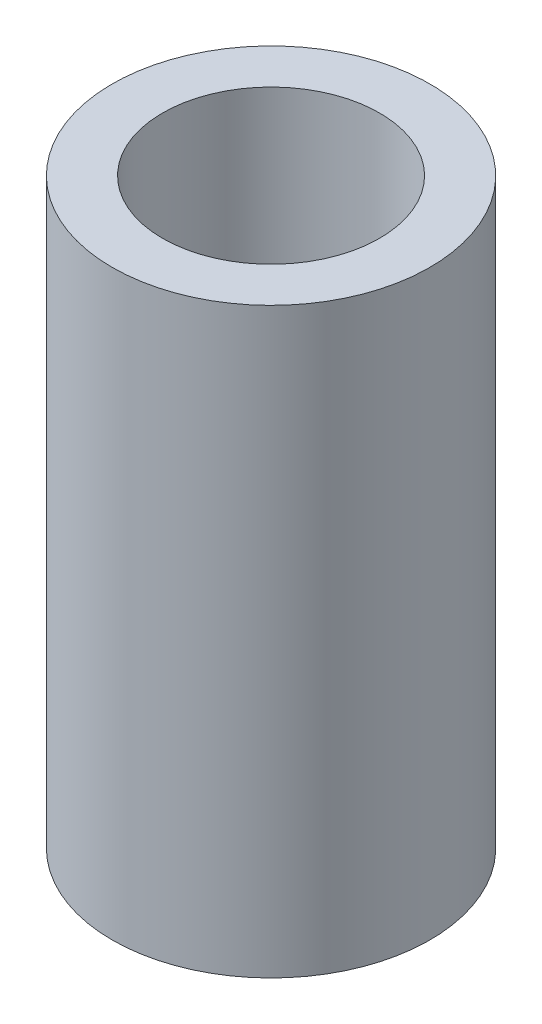
ISO-10303-21;
HEADER;
FILE_DESCRIPTION(('STEP AP214'),'2;1');
FILE_NAME('part.step','',(''),(''),'','','');
FILE_SCHEMA(('AUTOMOTIVE_DESIGN { 1 0 10303 214 1 1 1 1 }'));
ENDSEC;
DATA;
#1=APPLICATION_CONTEXT('core data for automotive mechanical design processes');
#2=APPLICATION_PROTOCOL_DEFINITION('international standard','automotive_design',2000,#1);
#3=PRODUCT_CONTEXT('',#1,'mechanical');
#4=PRODUCT('Part','Part','',(#3));
#5=PRODUCT_RELATED_PRODUCT_CATEGORY('part','',(#4));
#6=PRODUCT_DEFINITION_FORMATION('','',#4);
#7=PRODUCT_DEFINITION_CONTEXT('part definition',#1,'design');
#8=PRODUCT_DEFINITION('design','',#6,#7);
#9=PRODUCT_DEFINITION_SHAPE('','',#8);
#10=(LENGTH_UNIT() NAMED_UNIT(*) SI_UNIT(.MILLI.,.METRE.));
#11=(NAMED_UNIT(*) PLANE_ANGLE_UNIT() SI_UNIT($,.RADIAN.));
#12=(NAMED_UNIT(*) SI_UNIT($,.STERADIAN.) SOLID_ANGLE_UNIT());
#13=UNCERTAINTY_MEASURE_WITH_UNIT(LENGTH_MEASURE(1.E-05),#10,'distance_accuracy_value','');
#14=(GEOMETRIC_REPRESENTATION_CONTEXT(3) GLOBAL_UNCERTAINTY_ASSIGNED_CONTEXT((#13)) GLOBAL_UNIT_ASSIGNED_CONTEXT((#10,
#11,#12)) REPRESENTATION_CONTEXT('',''));
#15=CARTESIAN_POINT('',(0.,0.,0.));
#16=DIRECTION('',(0.,0.,1.));
#17=DIRECTION('',(1.,0.,0.));
#18=AXIS2_PLACEMENT_3D('',#15,#16,#17);
#19=CARTESIAN_POINT('',(0.,22.,0.));
#20=DIRECTION('',(0.,-1.,0.));
#21=DIRECTION('',(0.,0.,-1.));
#22=AXIS2_PLACEMENT_3D('',#19,#20,#21);
#23=CYLINDRICAL_SURFACE('',#22,6.);
#24=CARTESIAN_POINT('',(0.,22.,0.));
#25=DIRECTION('',(0.,1.,0.));
#26=DIRECTION('',(0.,0.,1.));
#27=AXIS2_PLACEMENT_3D('',#24,#25,#26);
#28=CIRCLE('',#27,6.);
#29=CARTESIAN_POINT('',(0.,22.,6.));
#30=VERTEX_POINT('',#29);
#31=EDGE_CURVE('E10',#30,#30,#28,.T.);
#32=ORIENTED_EDGE('',*,*,#31,.F.);
#33=EDGE_LOOP('',(#32));
#34=FACE_BOUND('',#33,.T.);
#35=CARTESIAN_POINT('',(0.,0.,0.));
#36=DIRECTION('',(0.,1.,0.));
#37=DIRECTION('',(0.,0.,1.));
#38=AXIS2_PLACEMENT_3D('',#35,#36,#37);
#39=CIRCLE('',#38,6.);
#40=CARTESIAN_POINT('',(0.,0.,6.));
#41=VERTEX_POINT('',#40);
#42=EDGE_CURVE('E34',#41,#41,#39,.T.);
#43=ORIENTED_EDGE('',*,*,#42,.T.);
#44=EDGE_LOOP('',(#43));
#45=FACE_BOUND('',#44,.T.);
#46=ADVANCED_FACE('F31',(#34,#45),#23,.T.);
#47=CARTESIAN_POINT('',(0.,22.,0.));
#48=DIRECTION('',(0.,1.,0.));
#49=DIRECTION('',(0.,0.,1.));
#50=AXIS2_PLACEMENT_3D('',#47,#48,#49);
#51=PLANE('',#50);
#52=CARTESIAN_POINT('',(0.,22.,0.));
#53=DIRECTION('',(0.,1.,0.));
#54=DIRECTION('',(0.,0.,1.));
#55=AXIS2_PLACEMENT_3D('',#52,#53,#54);
#56=CIRCLE('',#55,4.1);
#57=CARTESIAN_POINT('',(0.,22.,4.1));
#58=VERTEX_POINT('',#57);
#59=EDGE_CURVE('E43',#58,#58,#56,.T.);
#60=ORIENTED_EDGE('',*,*,#59,.F.);
#61=EDGE_LOOP('',(#60));
#62=FACE_BOUND('',#61,.T.);
#63=ORIENTED_EDGE('',*,*,#31,.T.);
#64=EDGE_LOOP('',(#63));
#65=FACE_BOUND('',#64,.T.);
#66=ADVANCED_FACE('F76',(#62,#65),#51,.T.);
#67=CARTESIAN_POINT('',(0.,0.,0.));
#68=DIRECTION('',(0.,1.,0.));
#69=DIRECTION('',(0.,0.,1.));
#70=AXIS2_PLACEMENT_3D('',#67,#68,#69);
#71=PLANE('',#70);
#72=ORIENTED_EDGE('',*,*,#42,.F.);
#73=EDGE_LOOP('',(#72));
#74=FACE_BOUND('',#73,.T.);
#75=ADVANCED_FACE('F72',(#74),#71,.F.);
#76=CARTESIAN_POINT('',(0.,12.,0.));
#77=DIRECTION('',(0.,1.,0.));
#78=DIRECTION('',(0.,0.,1.));
#79=AXIS2_PLACEMENT_3D('',#76,#77,#78);
#80=CYLINDRICAL_SURFACE('',#79,4.1);
#81=CARTESIAN_POINT('',(0.,12.,0.));
#82=DIRECTION('',(0.,1.,0.));
#83=DIRECTION('',(0.,0.,1.));
#84=AXIS2_PLACEMENT_3D('',#81,#82,#83);
#85=CIRCLE('',#84,4.1);
#86=CARTESIAN_POINT('',(0.,12.,4.1));
#87=VERTEX_POINT('',#86);
#88=EDGE_CURVE('E41',#87,#87,#85,.T.);
#89=ORIENTED_EDGE('',*,*,#88,.F.);
#90=EDGE_LOOP('',(#89));
#91=FACE_BOUND('',#90,.T.);
#92=ORIENTED_EDGE('',*,*,#59,.T.);
#93=EDGE_LOOP('',(#92));
#94=FACE_BOUND('',#93,.T.);
#95=ADVANCED_FACE('F66',(#91,#94),#80,.F.);
#96=CARTESIAN_POINT('',(0.,12.,0.));
#97=DIRECTION('',(0.,1.,0.));
#98=DIRECTION('',(0.,0.,1.));
#99=AXIS2_PLACEMENT_3D('',#96,#97,#98);
#100=PLANE('',#99);
#101=CARTESIAN_POINT('',(0.,12.,0.));
#102=DIRECTION('',(0.,1.,0.));
#103=DIRECTION('',(0.,0.,1.));
#104=AXIS2_PLACEMENT_3D('',#101,#102,#103);
#105=CIRCLE('',#104,2.1);
#106=CARTESIAN_POINT('',(0.,12.,2.1));
#107=VERTEX_POINT('',#106);
#108=EDGE_CURVE('E49',#107,#107,#105,.T.);
#109=ORIENTED_EDGE('',*,*,#108,.F.);
#110=EDGE_LOOP('',(#109));
#111=FACE_BOUND('',#110,.T.);
#112=ORIENTED_EDGE('',*,*,#88,.T.);
#113=EDGE_LOOP('',(#112));
#114=FACE_BOUND('',#113,.T.);
#115=ADVANCED_FACE('F60',(#111,#114),#100,.T.);
#116=CARTESIAN_POINT('',(0.,2.,0.));
#117=DIRECTION('',(0.,1.,0.));
#118=DIRECTION('',(0.,0.,1.));
#119=AXIS2_PLACEMENT_3D('',#116,#117,#118);
#120=CYLINDRICAL_SURFACE('',#119,2.1);
#121=CARTESIAN_POINT('',(0.,2.,0.));
#122=DIRECTION('',(0.,1.,0.));
#123=DIRECTION('',(0.,0.,1.));
#124=AXIS2_PLACEMENT_3D('',#121,#122,#123);
#125=CIRCLE('',#124,2.1);
#126=CARTESIAN_POINT('',(0.,2.,2.1));
#127=VERTEX_POINT('',#126);
#128=EDGE_CURVE('E46',#127,#127,#125,.T.);
#129=ORIENTED_EDGE('',*,*,#128,.F.);
#130=EDGE_LOOP('',(#129));
#131=FACE_BOUND('',#130,.T.);
#132=ORIENTED_EDGE('',*,*,#108,.T.);
#133=EDGE_LOOP('',(#132));
#134=FACE_BOUND('',#133,.T.);
#135=ADVANCED_FACE('F57',(#131,#134),#120,.F.);
#136=CARTESIAN_POINT('',(0.,2.,0.));
#137=DIRECTION('',(0.,1.,0.));
#138=DIRECTION('',(0.,0.,1.));
#139=AXIS2_PLACEMENT_3D('',#136,#137,#138);
#140=PLANE('',#139);
#141=ORIENTED_EDGE('',*,*,#128,.T.);
#142=EDGE_LOOP('',(#141));
#143=FACE_BOUND('',#142,.T.);
#144=ADVANCED_FACE('F55',(#143),#140,.T.);
#145=CLOSED_SHELL('',(#46,#66,#75,#95,#115,#135,#144));
#146=MANIFOLD_SOLID_BREP('B2',#145);
#147=ADVANCED_BREP_SHAPE_REPRESENTATION('',(#18,#146),#14);
#148=SHAPE_DEFINITION_REPRESENTATION(#9,#147);
ENDSEC;
END-ISO-10303-21;
